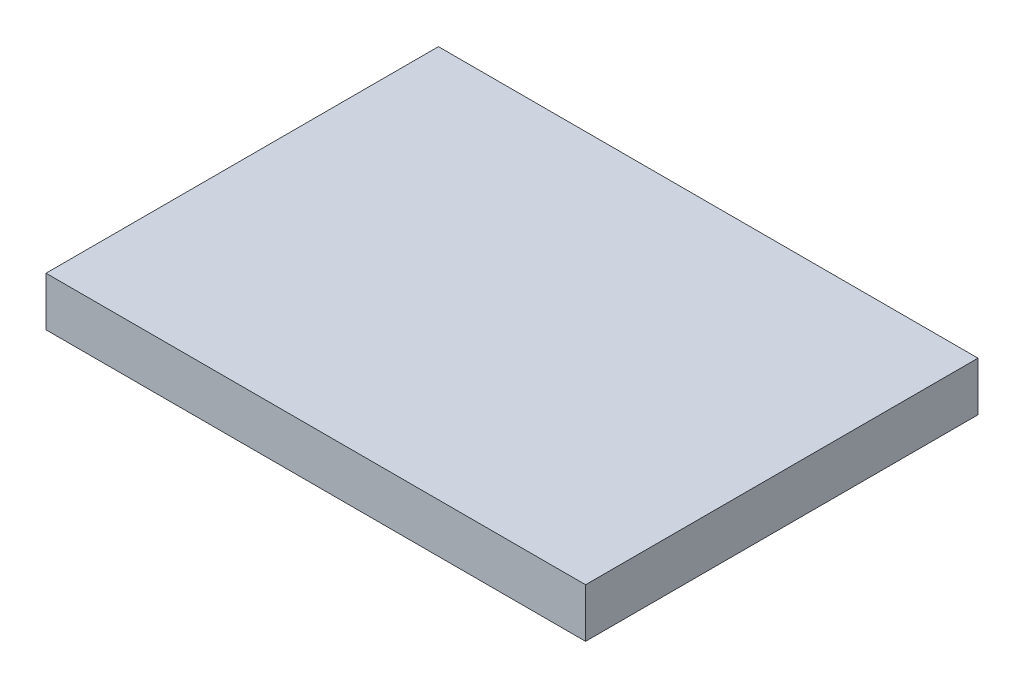
ISO-10303-21;
HEADER;
FILE_DESCRIPTION(('STEP AP214'),'2;1');
FILE_NAME('part.step','',(''),(''),'','','');
FILE_SCHEMA(('AUTOMOTIVE_DESIGN { 1 0 10303 214 1 1 1 1 }'));
ENDSEC;
DATA;
#1=APPLICATION_CONTEXT('core data for automotive mechanical design processes');
#2=APPLICATION_PROTOCOL_DEFINITION('international standard','automotive_design',2000,#1);
#3=PRODUCT_CONTEXT('',#1,'mechanical');
#4=PRODUCT('Part','Part','',(#3));
#5=PRODUCT_RELATED_PRODUCT_CATEGORY('part','',(#4));
#6=PRODUCT_DEFINITION_FORMATION('','',#4);
#7=PRODUCT_DEFINITION_CONTEXT('part definition',#1,'design');
#8=PRODUCT_DEFINITION('design','',#6,#7);
#9=PRODUCT_DEFINITION_SHAPE('','',#8);
#10=(LENGTH_UNIT() NAMED_UNIT(*) SI_UNIT(.MILLI.,.METRE.));
#11=(NAMED_UNIT(*) PLANE_ANGLE_UNIT() SI_UNIT($,.RADIAN.));
#12=(NAMED_UNIT(*) SI_UNIT($,.STERADIAN.) SOLID_ANGLE_UNIT());
#13=UNCERTAINTY_MEASURE_WITH_UNIT(LENGTH_MEASURE(1.E-05),#10,'distance_accuracy_value','');
#14=(GEOMETRIC_REPRESENTATION_CONTEXT(3) GLOBAL_UNCERTAINTY_ASSIGNED_CONTEXT((#13)) GLOBAL_UNIT_ASSIGNED_CONTEXT((#10,
#11,#12)) REPRESENTATION_CONTEXT('',''));
#15=CARTESIAN_POINT('',(0.,0.,0.));
#16=DIRECTION('',(0.,0.,1.));
#17=DIRECTION('',(1.,0.,0.));
#18=AXIS2_PLACEMENT_3D('',#15,#16,#17);
#19=CARTESIAN_POINT('',(0.,3.175,0.));
#20=DIRECTION('',(1.,0.,0.));
#21=DIRECTION('',(0.,0.,-1.));
#22=AXIS2_PLACEMENT_3D('',#19,#20,#21);
#23=PLANE('',#22);
#24=DIRECTION('',(0.,0.,1.));
#25=VECTOR('',#24,1.);
#26=CARTESIAN_POINT('',(0.,0.,0.));
#27=LINE('',#26,#25);
#28=CARTESIAN_POINT('',(0.,0.,-25.4));
#29=VERTEX_POINT('',#28);
#30=CARTESIAN_POINT('',(0.,0.,0.));
#31=VERTEX_POINT('',#30);
#32=EDGE_CURVE('E95',#29,#31,#27,.T.);
#33=ORIENTED_EDGE('',*,*,#32,.T.);
#34=DIRECTION('',(0.,-1.,0.));
#35=VECTOR('',#34,1.);
#36=CARTESIAN_POINT('',(0.,3.175,0.));
#37=LINE('',#36,#35);
#38=CARTESIAN_POINT('',(0.,3.175,0.));
#39=VERTEX_POINT('',#38);
#40=EDGE_CURVE('E11',#39,#31,#37,.T.);
#41=ORIENTED_EDGE('',*,*,#40,.F.);
#42=DIRECTION('',(0.,0.,1.));
#43=VECTOR('',#42,1.);
#44=CARTESIAN_POINT('',(0.,3.175,0.));
#45=LINE('',#44,#43);
#46=CARTESIAN_POINT('',(0.,3.175,-25.4));
#47=VERTEX_POINT('',#46);
#48=EDGE_CURVE('E83',#47,#39,#45,.T.);
#49=ORIENTED_EDGE('',*,*,#48,.F.);
#50=DIRECTION('',(0.,-1.,0.));
#51=VECTOR('',#50,1.);
#52=CARTESIAN_POINT('',(0.,3.175,-25.4));
#53=LINE('',#52,#51);
#54=EDGE_CURVE('E91',#47,#29,#53,.T.);
#55=ORIENTED_EDGE('',*,*,#54,.T.);
#56=EDGE_LOOP('',(#33,#41,#49,#55));
#57=FACE_BOUND('',#56,.T.);
#58=ADVANCED_FACE('F32',(#57),#23,.F.);
#59=CARTESIAN_POINT('',(0.,3.175,0.));
#60=DIRECTION('',(0.,0.,-1.));
#61=DIRECTION('',(-1.,0.,0.));
#62=AXIS2_PLACEMENT_3D('',#59,#60,#61);
#63=PLANE('',#62);
#64=DIRECTION('',(1.,0.,0.));
#65=VECTOR('',#64,1.);
#66=CARTESIAN_POINT('',(0.,0.,0.));
#67=LINE('',#66,#65);
#68=CARTESIAN_POINT('',(34.925,0.,0.));
#69=VERTEX_POINT('',#68);
#70=EDGE_CURVE('E87',#31,#69,#67,.T.);
#71=ORIENTED_EDGE('',*,*,#70,.T.);
#72=DIRECTION('',(0.,-1.,0.));
#73=VECTOR('',#72,1.);
#74=CARTESIAN_POINT('',(34.925,3.175,0.));
#75=LINE('',#74,#73);
#76=CARTESIAN_POINT('',(34.925,3.175,0.));
#77=VERTEX_POINT('',#76);
#78=EDGE_CURVE('E40',#77,#69,#75,.T.);
#79=ORIENTED_EDGE('',*,*,#78,.F.);
#80=DIRECTION('',(1.,0.,0.));
#81=VECTOR('',#80,1.);
#82=CARTESIAN_POINT('',(0.,3.175,0.));
#83=LINE('',#82,#81);
#84=EDGE_CURVE('E78',#39,#77,#83,.T.);
#85=ORIENTED_EDGE('',*,*,#84,.F.);
#86=ORIENTED_EDGE('',*,*,#40,.T.);
#87=EDGE_LOOP('',(#71,#79,#85,#86));
#88=FACE_BOUND('',#87,.T.);
#89=ADVANCED_FACE('F86',(#88),#63,.F.);
#90=CARTESIAN_POINT('',(34.925,3.175,0.));
#91=DIRECTION('',(-1.,0.,0.));
#92=DIRECTION('',(0.,0.,1.));
#93=AXIS2_PLACEMENT_3D('',#90,#91,#92);
#94=PLANE('',#93);
#95=DIRECTION('',(0.,0.,-1.));
#96=VECTOR('',#95,1.);
#97=CARTESIAN_POINT('',(34.925,0.,0.));
#98=LINE('',#97,#96);
#99=CARTESIAN_POINT('',(34.925,0.,-25.4));
#100=VERTEX_POINT('',#99);
#101=EDGE_CURVE('E65',#69,#100,#98,.T.);
#102=ORIENTED_EDGE('',*,*,#101,.T.);
#103=DIRECTION('',(0.,-1.,0.));
#104=VECTOR('',#103,1.);
#105=CARTESIAN_POINT('',(34.925,3.175,-25.4));
#106=LINE('',#105,#104);
#107=CARTESIAN_POINT('',(34.925,3.175,-25.4));
#108=VERTEX_POINT('',#107);
#109=EDGE_CURVE('E88',#108,#100,#106,.T.);
#110=ORIENTED_EDGE('',*,*,#109,.F.);
#111=DIRECTION('',(0.,0.,-1.));
#112=VECTOR('',#111,1.);
#113=CARTESIAN_POINT('',(34.925,3.175,0.));
#114=LINE('',#113,#112);
#115=EDGE_CURVE('E81',#77,#108,#114,.T.);
#116=ORIENTED_EDGE('',*,*,#115,.F.);
#117=ORIENTED_EDGE('',*,*,#78,.T.);
#118=EDGE_LOOP('',(#102,#110,#116,#117));
#119=FACE_BOUND('',#118,.T.);
#120=ADVANCED_FACE('F89',(#119),#94,.F.);
#121=CARTESIAN_POINT('',(0.,3.175,-25.4));
#122=DIRECTION('',(0.,0.,1.));
#123=DIRECTION('',(1.,0.,0.));
#124=AXIS2_PLACEMENT_3D('',#121,#122,#123);
#125=PLANE('',#124);
#126=DIRECTION('',(-1.,0.,0.));
#127=VECTOR('',#126,1.);
#128=CARTESIAN_POINT('',(0.,0.,-25.4));
#129=LINE('',#128,#127);
#130=EDGE_CURVE('E71',#100,#29,#129,.T.);
#131=ORIENTED_EDGE('',*,*,#130,.T.);
#132=ORIENTED_EDGE('',*,*,#54,.F.);
#133=DIRECTION('',(-1.,0.,0.));
#134=VECTOR('',#133,1.);
#135=CARTESIAN_POINT('',(0.,3.175,-25.4));
#136=LINE('',#135,#134);
#137=EDGE_CURVE('E48',#108,#47,#136,.T.);
#138=ORIENTED_EDGE('',*,*,#137,.F.);
#139=ORIENTED_EDGE('',*,*,#109,.T.);
#140=EDGE_LOOP('',(#131,#132,#138,#139));
#141=FACE_BOUND('',#140,.T.);
#142=ADVANCED_FACE('F102',(#141),#125,.F.);
#143=CARTESIAN_POINT('',(0.,3.175,0.));
#144=DIRECTION('',(0.,-1.,0.));
#145=DIRECTION('',(0.,0.,-1.));
#146=AXIS2_PLACEMENT_3D('',#143,#144,#145);
#147=PLANE('',#146);
#148=ORIENTED_EDGE('',*,*,#48,.T.);
#149=ORIENTED_EDGE('',*,*,#84,.T.);
#150=ORIENTED_EDGE('',*,*,#115,.T.);
#151=ORIENTED_EDGE('',*,*,#137,.T.);
#152=EDGE_LOOP('',(#148,#149,#150,#151));
#153=FACE_BOUND('',#152,.T.);
#154=ADVANCED_FACE('F79',(#153),#147,.F.);
#155=CARTESIAN_POINT('',(0.,0.,0.));
#156=DIRECTION('',(0.,-1.,0.));
#157=DIRECTION('',(0.,0.,-1.));
#158=AXIS2_PLACEMENT_3D('',#155,#156,#157);
#159=PLANE('',#158);
#160=ORIENTED_EDGE('',*,*,#32,.F.);
#161=ORIENTED_EDGE('',*,*,#130,.F.);
#162=ORIENTED_EDGE('',*,*,#101,.F.);
#163=ORIENTED_EDGE('',*,*,#70,.F.);
#164=EDGE_LOOP('',(#160,#161,#162,#163));
#165=FACE_BOUND('',#164,.T.);
#166=ADVANCED_FACE('F105',(#165),#159,.T.);
#167=CLOSED_SHELL('',(#58,#89,#120,#142,#154,#166));
#168=MANIFOLD_SOLID_BREP('B2',#167);
#169=ADVANCED_BREP_SHAPE_REPRESENTATION('',(#18,#168),#14);
#170=SHAPE_DEFINITION_REPRESENTATION(#9,#169);
ENDSEC;
END-ISO-10303-21;
